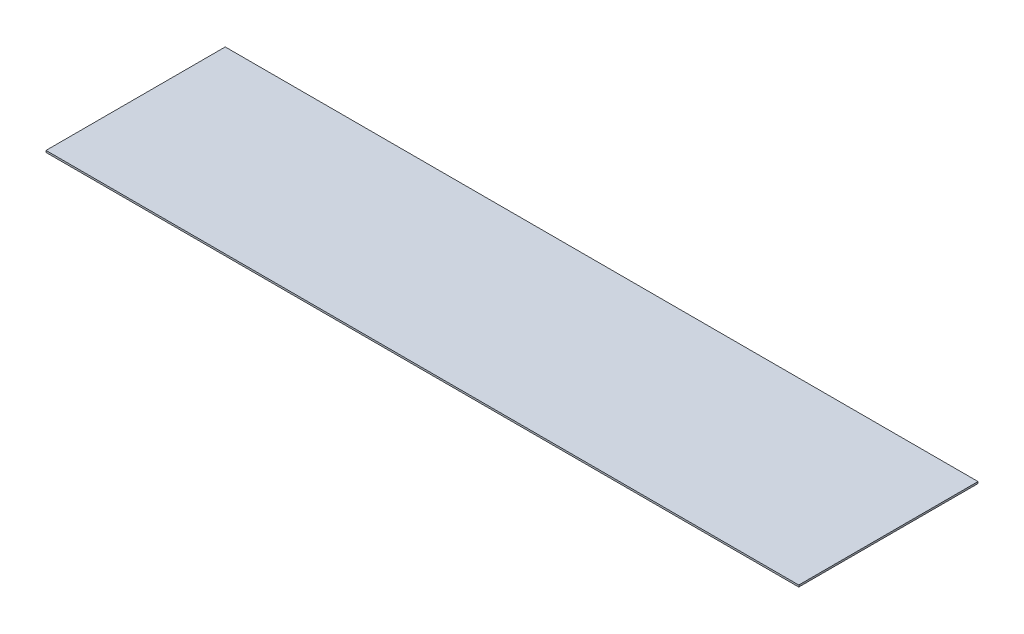
ISO-10303-21;
HEADER;
FILE_DESCRIPTION(('STEP AP214'),'2;1');
FILE_NAME('part.step','',(''),(''),'','','');
FILE_SCHEMA(('AUTOMOTIVE_DESIGN { 1 0 10303 214 1 1 1 1 }'));
ENDSEC;
DATA;
#1=APPLICATION_CONTEXT('core data for automotive mechanical design processes');
#2=APPLICATION_PROTOCOL_DEFINITION('international standard','automotive_design',2000,#1);
#3=PRODUCT_CONTEXT('',#1,'mechanical');
#4=PRODUCT('Part','Part','',(#3));
#5=PRODUCT_RELATED_PRODUCT_CATEGORY('part','',(#4));
#6=PRODUCT_DEFINITION_FORMATION('','',#4);
#7=PRODUCT_DEFINITION_CONTEXT('part definition',#1,'design');
#8=PRODUCT_DEFINITION('design','',#6,#7);
#9=PRODUCT_DEFINITION_SHAPE('','',#8);
#10=(LENGTH_UNIT() NAMED_UNIT(*) SI_UNIT(.MILLI.,.METRE.));
#11=(NAMED_UNIT(*) PLANE_ANGLE_UNIT() SI_UNIT($,.RADIAN.));
#12=(NAMED_UNIT(*) SI_UNIT($,.STERADIAN.) SOLID_ANGLE_UNIT());
#13=UNCERTAINTY_MEASURE_WITH_UNIT(LENGTH_MEASURE(1.E-05),#10,'distance_accuracy_value','');
#14=(GEOMETRIC_REPRESENTATION_CONTEXT(3) GLOBAL_UNCERTAINTY_ASSIGNED_CONTEXT((#13)) GLOBAL_UNIT_ASSIGNED_CONTEXT((#10,
#11,#12)) REPRESENTATION_CONTEXT('',''));
#15=CARTESIAN_POINT('',(0.,0.,0.));
#16=DIRECTION('',(0.,0.,1.));
#17=DIRECTION('',(1.,0.,0.));
#18=AXIS2_PLACEMENT_3D('',#15,#16,#17);
#19=CARTESIAN_POINT('',(105.,0.5,25.));
#20=DIRECTION('',(-1.,0.,0.));
#21=DIRECTION('',(0.,0.,1.));
#22=AXIS2_PLACEMENT_3D('',#19,#20,#21);
#23=PLANE('',#22);
#24=DIRECTION('',(0.,0.,-1.));
#25=VECTOR('',#24,1.);
#26=CARTESIAN_POINT('',(105.,0.,25.));
#27=LINE('',#26,#25);
#28=CARTESIAN_POINT('',(105.,0.,25.));
#29=VERTEX_POINT('',#28);
#30=CARTESIAN_POINT('',(105.,0.,-25.));
#31=VERTEX_POINT('',#30);
#32=EDGE_CURVE('E98',#29,#31,#27,.T.);
#33=ORIENTED_EDGE('',*,*,#32,.T.);
#34=DIRECTION('',(0.,-1.,0.));
#35=VECTOR('',#34,1.);
#36=CARTESIAN_POINT('',(105.,0.5,-25.));
#37=LINE('',#36,#35);
#38=CARTESIAN_POINT('',(105.,0.5,-25.));
#39=VERTEX_POINT('',#38);
#40=EDGE_CURVE('E11',#39,#31,#37,.T.);
#41=ORIENTED_EDGE('',*,*,#40,.F.);
#42=DIRECTION('',(0.,0.,-1.));
#43=VECTOR('',#42,1.);
#44=CARTESIAN_POINT('',(105.,0.5,25.));
#45=LINE('',#44,#43);
#46=CARTESIAN_POINT('',(105.,0.5,25.));
#47=VERTEX_POINT('',#46);
#48=EDGE_CURVE('E86',#47,#39,#45,.T.);
#49=ORIENTED_EDGE('',*,*,#48,.F.);
#50=DIRECTION('',(0.,-1.,0.));
#51=VECTOR('',#50,1.);
#52=CARTESIAN_POINT('',(105.,0.5,25.));
#53=LINE('',#52,#51);
#54=EDGE_CURVE('E94',#47,#29,#53,.T.);
#55=ORIENTED_EDGE('',*,*,#54,.T.);
#56=EDGE_LOOP('',(#33,#41,#49,#55));
#57=FACE_BOUND('',#56,.T.);
#58=ADVANCED_FACE('F35',(#57),#23,.F.);
#59=CARTESIAN_POINT('',(-105.,0.5,-25.));
#60=DIRECTION('',(0.,0.,1.));
#61=DIRECTION('',(1.,0.,0.));
#62=AXIS2_PLACEMENT_3D('',#59,#60,#61);
#63=PLANE('',#62);
#64=DIRECTION('',(-1.,0.,0.));
#65=VECTOR('',#64,1.);
#66=CARTESIAN_POINT('',(-105.,0.,-25.));
#67=LINE('',#66,#65);
#68=CARTESIAN_POINT('',(-105.,0.,-25.));
#69=VERTEX_POINT('',#68);
#70=EDGE_CURVE('E90',#31,#69,#67,.T.);
#71=ORIENTED_EDGE('',*,*,#70,.T.);
#72=DIRECTION('',(0.,-1.,0.));
#73=VECTOR('',#72,1.);
#74=CARTESIAN_POINT('',(-105.,0.5,-25.));
#75=LINE('',#74,#73);
#76=CARTESIAN_POINT('',(-105.,0.5,-25.));
#77=VERTEX_POINT('',#76);
#78=EDGE_CURVE('E43',#77,#69,#75,.T.);
#79=ORIENTED_EDGE('',*,*,#78,.F.);
#80=DIRECTION('',(-1.,0.,0.));
#81=VECTOR('',#80,1.);
#82=CARTESIAN_POINT('',(-105.,0.5,-25.));
#83=LINE('',#82,#81);
#84=EDGE_CURVE('E81',#39,#77,#83,.T.);
#85=ORIENTED_EDGE('',*,*,#84,.F.);
#86=ORIENTED_EDGE('',*,*,#40,.T.);
#87=EDGE_LOOP('',(#71,#79,#85,#86));
#88=FACE_BOUND('',#87,.T.);
#89=ADVANCED_FACE('F89',(#88),#63,.F.);
#90=CARTESIAN_POINT('',(-105.,0.5,25.));
#91=DIRECTION('',(1.,0.,0.));
#92=DIRECTION('',(0.,0.,-1.));
#93=AXIS2_PLACEMENT_3D('',#90,#91,#92);
#94=PLANE('',#93);
#95=DIRECTION('',(0.,0.,1.));
#96=VECTOR('',#95,1.);
#97=CARTESIAN_POINT('',(-105.,0.,25.));
#98=LINE('',#97,#96);
#99=CARTESIAN_POINT('',(-105.,0.,25.));
#100=VERTEX_POINT('',#99);
#101=EDGE_CURVE('E68',#69,#100,#98,.T.);
#102=ORIENTED_EDGE('',*,*,#101,.T.);
#103=DIRECTION('',(0.,-1.,0.));
#104=VECTOR('',#103,1.);
#105=CARTESIAN_POINT('',(-105.,0.5,25.));
#106=LINE('',#105,#104);
#107=CARTESIAN_POINT('',(-105.,0.5,25.));
#108=VERTEX_POINT('',#107);
#109=EDGE_CURVE('E91',#108,#100,#106,.T.);
#110=ORIENTED_EDGE('',*,*,#109,.F.);
#111=DIRECTION('',(0.,0.,1.));
#112=VECTOR('',#111,1.);
#113=CARTESIAN_POINT('',(-105.,0.5,25.));
#114=LINE('',#113,#112);
#115=EDGE_CURVE('E84',#77,#108,#114,.T.);
#116=ORIENTED_EDGE('',*,*,#115,.F.);
#117=ORIENTED_EDGE('',*,*,#78,.T.);
#118=EDGE_LOOP('',(#102,#110,#116,#117));
#119=FACE_BOUND('',#118,.T.);
#120=ADVANCED_FACE('F92',(#119),#94,.F.);
#121=CARTESIAN_POINT('',(-105.,0.5,25.));
#122=DIRECTION('',(0.,0.,-1.));
#123=DIRECTION('',(-1.,0.,0.));
#124=AXIS2_PLACEMENT_3D('',#121,#122,#123);
#125=PLANE('',#124);
#126=DIRECTION('',(1.,0.,0.));
#127=VECTOR('',#126,1.);
#128=CARTESIAN_POINT('',(-105.,0.,25.));
#129=LINE('',#128,#127);
#130=EDGE_CURVE('E74',#100,#29,#129,.T.);
#131=ORIENTED_EDGE('',*,*,#130,.T.);
#132=ORIENTED_EDGE('',*,*,#54,.F.);
#133=DIRECTION('',(1.,0.,0.));
#134=VECTOR('',#133,1.);
#135=CARTESIAN_POINT('',(-105.,0.5,25.));
#136=LINE('',#135,#134);
#137=EDGE_CURVE('E51',#108,#47,#136,.T.);
#138=ORIENTED_EDGE('',*,*,#137,.F.);
#139=ORIENTED_EDGE('',*,*,#109,.T.);
#140=EDGE_LOOP('',(#131,#132,#138,#139));
#141=FACE_BOUND('',#140,.T.);
#142=ADVANCED_FACE('F105',(#141),#125,.F.);
#143=CARTESIAN_POINT('',(0.,0.5,0.));
#144=DIRECTION('',(0.,-1.,0.));
#145=DIRECTION('',(0.,0.,-1.));
#146=AXIS2_PLACEMENT_3D('',#143,#144,#145);
#147=PLANE('',#146);
#148=ORIENTED_EDGE('',*,*,#48,.T.);
#149=ORIENTED_EDGE('',*,*,#84,.T.);
#150=ORIENTED_EDGE('',*,*,#115,.T.);
#151=ORIENTED_EDGE('',*,*,#137,.T.);
#152=EDGE_LOOP('',(#148,#149,#150,#151));
#153=FACE_BOUND('',#152,.T.);
#154=ADVANCED_FACE('F82',(#153),#147,.F.);
#155=CARTESIAN_POINT('',(0.,0.,0.));
#156=DIRECTION('',(0.,-1.,0.));
#157=DIRECTION('',(0.,0.,-1.));
#158=AXIS2_PLACEMENT_3D('',#155,#156,#157);
#159=PLANE('',#158);
#160=ORIENTED_EDGE('',*,*,#32,.F.);
#161=ORIENTED_EDGE('',*,*,#130,.F.);
#162=ORIENTED_EDGE('',*,*,#101,.F.);
#163=ORIENTED_EDGE('',*,*,#70,.F.);
#164=EDGE_LOOP('',(#160,#161,#162,#163));
#165=FACE_BOUND('',#164,.T.);
#166=ADVANCED_FACE('F108',(#165),#159,.T.);
#167=CLOSED_SHELL('',(#58,#89,#120,#142,#154,#166));
#168=MANIFOLD_SOLID_BREP('B2',#167);
#169=ADVANCED_BREP_SHAPE_REPRESENTATION('',(#18,#168),#14);
#170=SHAPE_DEFINITION_REPRESENTATION(#9,#169);
ENDSEC;
END-ISO-10303-21;
